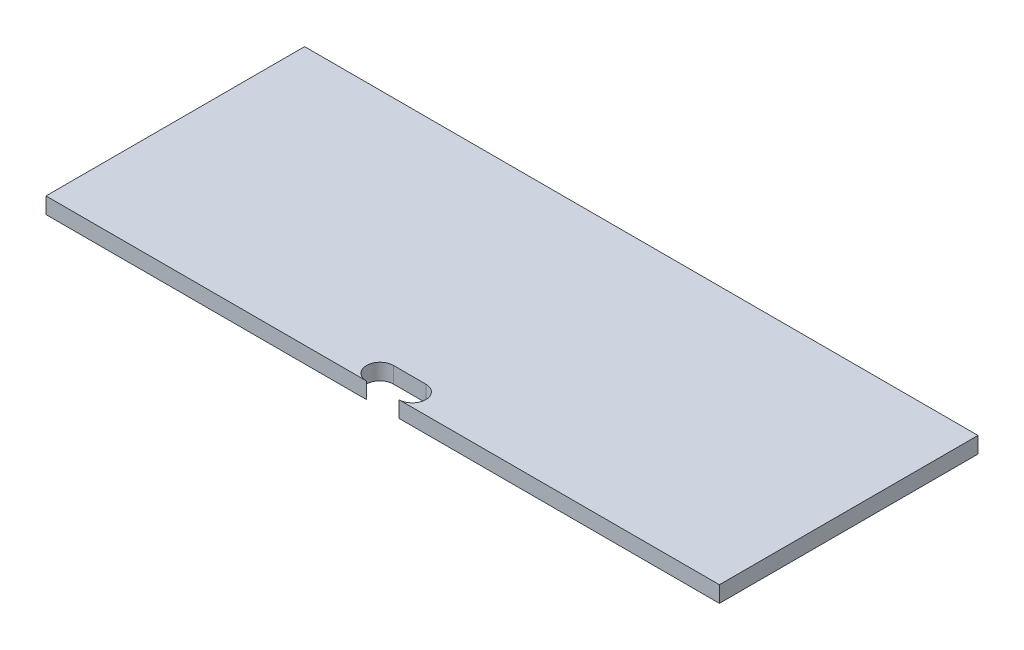
ISO-10303-21;
HEADER;
FILE_DESCRIPTION(('STEP AP214'),'2;1');
FILE_NAME('part.step','',(''),(''),'','','');
FILE_SCHEMA(('AUTOMOTIVE_DESIGN { 1 0 10303 214 1 1 1 1 }'));
ENDSEC;
DATA;
#1=APPLICATION_CONTEXT('core data for automotive mechanical design processes');
#2=APPLICATION_PROTOCOL_DEFINITION('international standard','automotive_design',2000,#1);
#3=PRODUCT_CONTEXT('',#1,'mechanical');
#4=PRODUCT('Part','Part','',(#3));
#5=PRODUCT_RELATED_PRODUCT_CATEGORY('part','',(#4));
#6=PRODUCT_DEFINITION_FORMATION('','',#4);
#7=PRODUCT_DEFINITION_CONTEXT('part definition',#1,'design');
#8=PRODUCT_DEFINITION('design','',#6,#7);
#9=PRODUCT_DEFINITION_SHAPE('','',#8);
#10=(LENGTH_UNIT() NAMED_UNIT(*) SI_UNIT(.MILLI.,.METRE.));
#11=(NAMED_UNIT(*) PLANE_ANGLE_UNIT() SI_UNIT($,.RADIAN.));
#12=(NAMED_UNIT(*) SI_UNIT($,.STERADIAN.) SOLID_ANGLE_UNIT());
#13=UNCERTAINTY_MEASURE_WITH_UNIT(LENGTH_MEASURE(1.E-05),#10,'distance_accuracy_value','');
#14=(GEOMETRIC_REPRESENTATION_CONTEXT(3) GLOBAL_UNCERTAINTY_ASSIGNED_CONTEXT((#13)) GLOBAL_UNIT_ASSIGNED_CONTEXT((#10,
#11,#12)) REPRESENTATION_CONTEXT('',''));
#15=CARTESIAN_POINT('',(0.,0.,0.));
#16=DIRECTION('',(0.,0.,1.));
#17=DIRECTION('',(1.,0.,0.));
#18=AXIS2_PLACEMENT_3D('',#15,#16,#17);
#19=CARTESIAN_POINT('',(-62.5,3.,24.));
#20=DIRECTION('',(0.,0.,-1.));
#21=DIRECTION('',(-1.,0.,0.));
#22=AXIS2_PLACEMENT_3D('',#19,#20,#21);
#23=PLANE('',#22);
#24=DIRECTION('',(0.,1.,0.));
#25=VECTOR('',#24,1.);
#26=CARTESIAN_POINT('',(3.,0.,24.));
#27=LINE('',#26,#25);
#28=CARTESIAN_POINT('',(3.,0.,24.));
#29=VERTEX_POINT('',#28);
#30=CARTESIAN_POINT('',(3.,3.,24.));
#31=VERTEX_POINT('',#30);
#32=EDGE_CURVE('E126',#29,#31,#27,.T.);
#33=ORIENTED_EDGE('',*,*,#32,.F.);
#34=DIRECTION('',(1.,0.,0.));
#35=VECTOR('',#34,1.);
#36=CARTESIAN_POINT('',(-62.5,0.,24.));
#37=LINE('',#36,#35);
#38=CARTESIAN_POINT('',(62.5,0.,24.));
#39=VERTEX_POINT('',#38);
#40=EDGE_CURVE('E86',#29,#39,#37,.T.);
#41=ORIENTED_EDGE('',*,*,#40,.T.);
#42=DIRECTION('',(0.,-1.,0.));
#43=VECTOR('',#42,1.);
#44=CARTESIAN_POINT('',(62.5,3.,24.));
#45=LINE('',#44,#43);
#46=CARTESIAN_POINT('',(62.5,3.,24.));
#47=VERTEX_POINT('',#46);
#48=EDGE_CURVE('E152',#47,#39,#45,.T.);
#49=ORIENTED_EDGE('',*,*,#48,.F.);
#50=DIRECTION('',(1.,0.,0.));
#51=VECTOR('',#50,1.);
#52=CARTESIAN_POINT('',(-62.5,3.,24.));
#53=LINE('',#52,#51);
#54=EDGE_CURVE('E64',#31,#47,#53,.T.);
#55=ORIENTED_EDGE('',*,*,#54,.F.);
#56=EDGE_LOOP('',(#33,#41,#49,#55));
#57=FACE_BOUND('',#56,.T.);
#58=ADVANCED_FACE('F39',(#57),#23,.F.);
#59=CARTESIAN_POINT('',(62.5,3.,24.));
#60=DIRECTION('',(-1.,0.,0.));
#61=DIRECTION('',(0.,0.,1.));
#62=AXIS2_PLACEMENT_3D('',#59,#60,#61);
#63=PLANE('',#62);
#64=DIRECTION('',(0.,0.,-1.));
#65=VECTOR('',#64,1.);
#66=CARTESIAN_POINT('',(62.5,0.,24.));
#67=LINE('',#66,#65);
#68=CARTESIAN_POINT('',(62.5,0.,-24.));
#69=VERTEX_POINT('',#68);
#70=EDGE_CURVE('E167',#39,#69,#67,.T.);
#71=ORIENTED_EDGE('',*,*,#70,.T.);
#72=DIRECTION('',(0.,-1.,0.));
#73=VECTOR('',#72,1.);
#74=CARTESIAN_POINT('',(62.5,3.,-24.));
#75=LINE('',#74,#73);
#76=CARTESIAN_POINT('',(62.5,3.,-24.));
#77=VERTEX_POINT('',#76);
#78=EDGE_CURVE('E11',#77,#69,#75,.T.);
#79=ORIENTED_EDGE('',*,*,#78,.F.);
#80=DIRECTION('',(0.,0.,-1.));
#81=VECTOR('',#80,1.);
#82=CARTESIAN_POINT('',(62.5,3.,24.));
#83=LINE('',#82,#81);
#84=EDGE_CURVE('E143',#47,#77,#83,.T.);
#85=ORIENTED_EDGE('',*,*,#84,.F.);
#86=ORIENTED_EDGE('',*,*,#48,.T.);
#87=EDGE_LOOP('',(#71,#79,#85,#86));
#88=FACE_BOUND('',#87,.T.);
#89=ADVANCED_FACE('F41',(#88),#63,.F.);
#90=CARTESIAN_POINT('',(-62.5,3.,-24.));
#91=DIRECTION('',(0.,0.,1.));
#92=DIRECTION('',(1.,0.,0.));
#93=AXIS2_PLACEMENT_3D('',#90,#91,#92);
#94=PLANE('',#93);
#95=DIRECTION('',(-1.,0.,0.));
#96=VECTOR('',#95,1.);
#97=CARTESIAN_POINT('',(-62.5,0.,-24.));
#98=LINE('',#97,#96);
#99=CARTESIAN_POINT('',(-62.5,0.,-24.));
#100=VERTEX_POINT('',#99);
#101=EDGE_CURVE('E164',#69,#100,#98,.T.);
#102=ORIENTED_EDGE('',*,*,#101,.T.);
#103=DIRECTION('',(0.,-1.,0.));
#104=VECTOR('',#103,1.);
#105=CARTESIAN_POINT('',(-62.5,3.,-24.));
#106=LINE('',#105,#104);
#107=CARTESIAN_POINT('',(-62.5,3.,-24.));
#108=VERTEX_POINT('',#107);
#109=EDGE_CURVE('E48',#108,#100,#106,.T.);
#110=ORIENTED_EDGE('',*,*,#109,.F.);
#111=DIRECTION('',(-1.,0.,0.));
#112=VECTOR('',#111,1.);
#113=CARTESIAN_POINT('',(-62.5,3.,-24.));
#114=LINE('',#113,#112);
#115=EDGE_CURVE('E93',#77,#108,#114,.T.);
#116=ORIENTED_EDGE('',*,*,#115,.F.);
#117=ORIENTED_EDGE('',*,*,#78,.T.);
#118=EDGE_LOOP('',(#102,#110,#116,#117));
#119=FACE_BOUND('',#118,.T.);
#120=ADVANCED_FACE('F220',(#119),#94,.F.);
#121=CARTESIAN_POINT('',(-62.5,3.,24.));
#122=DIRECTION('',(1.,0.,0.));
#123=DIRECTION('',(0.,0.,-1.));
#124=AXIS2_PLACEMENT_3D('',#121,#122,#123);
#125=PLANE('',#124);
#126=DIRECTION('',(0.,0.,1.));
#127=VECTOR('',#126,1.);
#128=CARTESIAN_POINT('',(-62.5,0.,24.));
#129=LINE('',#128,#127);
#130=CARTESIAN_POINT('',(-62.5,0.,24.));
#131=VERTEX_POINT('',#130);
#132=EDGE_CURVE('E148',#100,#131,#129,.T.);
#133=ORIENTED_EDGE('',*,*,#132,.T.);
#134=DIRECTION('',(0.,-1.,0.));
#135=VECTOR('',#134,1.);
#136=CARTESIAN_POINT('',(-62.5,3.,24.));
#137=LINE('',#136,#135);
#138=CARTESIAN_POINT('',(-62.5,3.,24.));
#139=VERTEX_POINT('',#138);
#140=EDGE_CURVE('E141',#139,#131,#137,.T.);
#141=ORIENTED_EDGE('',*,*,#140,.F.);
#142=DIRECTION('',(0.,0.,1.));
#143=VECTOR('',#142,1.);
#144=CARTESIAN_POINT('',(-62.5,3.,24.));
#145=LINE('',#144,#143);
#146=EDGE_CURVE('E162',#108,#139,#145,.T.);
#147=ORIENTED_EDGE('',*,*,#146,.F.);
#148=ORIENTED_EDGE('',*,*,#109,.T.);
#149=EDGE_LOOP('',(#133,#141,#147,#148));
#150=FACE_BOUND('',#149,.T.);
#151=ADVANCED_FACE('F161',(#150),#125,.F.);
#152=CARTESIAN_POINT('',(-3.,0.,24.));
#153=VERTEX_POINT('',#152);
#154=EDGE_CURVE('E132',#131,#153,#37,.T.);
#155=ORIENTED_EDGE('',*,*,#154,.T.);
#156=DIRECTION('',(0.,1.,0.));
#157=VECTOR('',#156,1.);
#158=CARTESIAN_POINT('',(-3.,0.,24.));
#159=LINE('',#158,#157);
#160=CARTESIAN_POINT('',(-3.,3.,24.));
#161=VERTEX_POINT('',#160);
#162=EDGE_CURVE('E115',#153,#161,#159,.T.);
#163=ORIENTED_EDGE('',*,*,#162,.T.);
#164=EDGE_CURVE('E155',#139,#161,#53,.T.);
#165=ORIENTED_EDGE('',*,*,#164,.F.);
#166=ORIENTED_EDGE('',*,*,#140,.T.);
#167=EDGE_LOOP('',(#155,#163,#165,#166));
#168=FACE_BOUND('',#167,.T.);
#169=ADVANCED_FACE('F139',(#168),#23,.F.);
#170=CARTESIAN_POINT('',(0.,3.,0.));
#171=DIRECTION('',(0.,-1.,0.));
#172=DIRECTION('',(0.,0.,-1.));
#173=AXIS2_PLACEMENT_3D('',#170,#171,#172);
#174=PLANE('',#173);
#175=ORIENTED_EDGE('',*,*,#164,.T.);
#176=CARTESIAN_POINT('',(-3.,3.,21.5));
#177=DIRECTION('',(0.,1.,0.));
#178=DIRECTION('',(0.,0.,1.));
#179=AXIS2_PLACEMENT_3D('',#176,#177,#178);
#180=CIRCLE('',#179,2.5);
#181=CARTESIAN_POINT('',(-3.,3.,19.));
#182=VERTEX_POINT('',#181);
#183=EDGE_CURVE('E120',#182,#161,#180,.T.);
#184=ORIENTED_EDGE('',*,*,#183,.F.);
#185=DIRECTION('',(-1.,0.,0.));
#186=VECTOR('',#185,1.);
#187=CARTESIAN_POINT('',(0.,3.,19.));
#188=LINE('',#187,#186);
#189=CARTESIAN_POINT('',(3.,3.,19.));
#190=VERTEX_POINT('',#189);
#191=EDGE_CURVE('E136',#190,#182,#188,.T.);
#192=ORIENTED_EDGE('',*,*,#191,.F.);
#193=CARTESIAN_POINT('',(3.,3.,21.5));
#194=DIRECTION('',(0.,1.,0.));
#195=DIRECTION('',(0.,0.,-1.));
#196=AXIS2_PLACEMENT_3D('',#193,#194,#195);
#197=CIRCLE('',#196,2.5);
#198=EDGE_CURVE('E189',#31,#190,#197,.T.);
#199=ORIENTED_EDGE('',*,*,#198,.F.);
#200=ORIENTED_EDGE('',*,*,#54,.T.);
#201=ORIENTED_EDGE('',*,*,#84,.T.);
#202=ORIENTED_EDGE('',*,*,#115,.T.);
#203=ORIENTED_EDGE('',*,*,#146,.T.);
#204=EDGE_LOOP('',(#175,#184,#192,#199,#200,#201,#202,#203));
#205=FACE_BOUND('',#204,.T.);
#206=ADVANCED_FACE('F204',(#205),#174,.F.);
#207=CARTESIAN_POINT('',(0.,0.,0.));
#208=DIRECTION('',(0.,-1.,0.));
#209=DIRECTION('',(0.,0.,-1.));
#210=AXIS2_PLACEMENT_3D('',#207,#208,#209);
#211=PLANE('',#210);
#212=CARTESIAN_POINT('',(-3.,0.,21.5));
#213=DIRECTION('',(0.,1.,0.));
#214=DIRECTION('',(0.,0.,1.));
#215=AXIS2_PLACEMENT_3D('',#212,#213,#214);
#216=CIRCLE('',#215,2.5);
#217=CARTESIAN_POINT('',(-3.,0.,19.));
#218=VERTEX_POINT('',#217);
#219=EDGE_CURVE('E118',#218,#153,#216,.T.);
#220=ORIENTED_EDGE('',*,*,#219,.T.);
#221=ORIENTED_EDGE('',*,*,#154,.F.);
#222=ORIENTED_EDGE('',*,*,#132,.F.);
#223=ORIENTED_EDGE('',*,*,#101,.F.);
#224=ORIENTED_EDGE('',*,*,#70,.F.);
#225=ORIENTED_EDGE('',*,*,#40,.F.);
#226=CARTESIAN_POINT('',(3.,0.,21.5));
#227=DIRECTION('',(0.,1.,0.));
#228=DIRECTION('',(0.,0.,-1.));
#229=AXIS2_PLACEMENT_3D('',#226,#227,#228);
#230=CIRCLE('',#229,2.5);
#231=CARTESIAN_POINT('',(3.,0.,19.));
#232=VERTEX_POINT('',#231);
#233=EDGE_CURVE('E135',#29,#232,#230,.T.);
#234=ORIENTED_EDGE('',*,*,#233,.T.);
#235=DIRECTION('',(-1.,0.,0.));
#236=VECTOR('',#235,1.);
#237=CARTESIAN_POINT('',(0.,0.,19.));
#238=LINE('',#237,#236);
#239=EDGE_CURVE('E55',#232,#218,#238,.T.);
#240=ORIENTED_EDGE('',*,*,#239,.T.);
#241=EDGE_LOOP('',(#220,#221,#222,#223,#224,#225,#234,#240));
#242=FACE_BOUND('',#241,.T.);
#243=ADVANCED_FACE('F130',(#242),#211,.T.);
#244=CARTESIAN_POINT('',(-3.,0.,21.5));
#245=DIRECTION('',(0.,1.,0.));
#246=DIRECTION('',(0.,0.,1.));
#247=AXIS2_PLACEMENT_3D('',#244,#245,#246);
#248=CYLINDRICAL_SURFACE('',#247,2.5);
#249=ORIENTED_EDGE('',*,*,#183,.T.);
#250=ORIENTED_EDGE('',*,*,#162,.F.);
#251=ORIENTED_EDGE('',*,*,#219,.F.);
#252=DIRECTION('',(0.,1.,0.));
#253=VECTOR('',#252,1.);
#254=CARTESIAN_POINT('',(-3.,0.,19.));
#255=LINE('',#254,#253);
#256=EDGE_CURVE('E170',#218,#182,#255,.T.);
#257=ORIENTED_EDGE('',*,*,#256,.T.);
#258=EDGE_LOOP('',(#249,#250,#251,#257));
#259=FACE_BOUND('',#258,.T.);
#260=ADVANCED_FACE('F117',(#259),#248,.F.);
#261=CARTESIAN_POINT('',(0.,0.,19.));
#262=DIRECTION('',(0.,0.,-1.));
#263=DIRECTION('',(-1.,0.,0.));
#264=AXIS2_PLACEMENT_3D('',#261,#262,#263);
#265=PLANE('',#264);
#266=ORIENTED_EDGE('',*,*,#191,.T.);
#267=ORIENTED_EDGE('',*,*,#256,.F.);
#268=ORIENTED_EDGE('',*,*,#239,.F.);
#269=DIRECTION('',(0.,1.,0.));
#270=VECTOR('',#269,1.);
#271=CARTESIAN_POINT('',(3.,0.,19.));
#272=LINE('',#271,#270);
#273=EDGE_CURVE('E181',#232,#190,#272,.T.);
#274=ORIENTED_EDGE('',*,*,#273,.T.);
#275=EDGE_LOOP('',(#266,#267,#268,#274));
#276=FACE_BOUND('',#275,.T.);
#277=ADVANCED_FACE('F206',(#276),#265,.F.);
#278=CARTESIAN_POINT('',(3.,0.,21.5));
#279=DIRECTION('',(0.,1.,0.));
#280=DIRECTION('',(0.,0.,1.));
#281=AXIS2_PLACEMENT_3D('',#278,#279,#280);
#282=CYLINDRICAL_SURFACE('',#281,2.5);
#283=ORIENTED_EDGE('',*,*,#198,.T.);
#284=ORIENTED_EDGE('',*,*,#273,.F.);
#285=ORIENTED_EDGE('',*,*,#233,.F.);
#286=ORIENTED_EDGE('',*,*,#32,.T.);
#287=EDGE_LOOP('',(#283,#284,#285,#286));
#288=FACE_BOUND('',#287,.T.);
#289=ADVANCED_FACE('F199',(#288),#282,.F.);
#290=CLOSED_SHELL('',(#58,#89,#120,#151,#169,#206,#243,#260,#277,#289));
#291=MANIFOLD_SOLID_BREP('B2',#290);
#292=ADVANCED_BREP_SHAPE_REPRESENTATION('',(#18,#291),#14);
#293=SHAPE_DEFINITION_REPRESENTATION(#9,#292);
ENDSEC;
END-ISO-10303-21;
